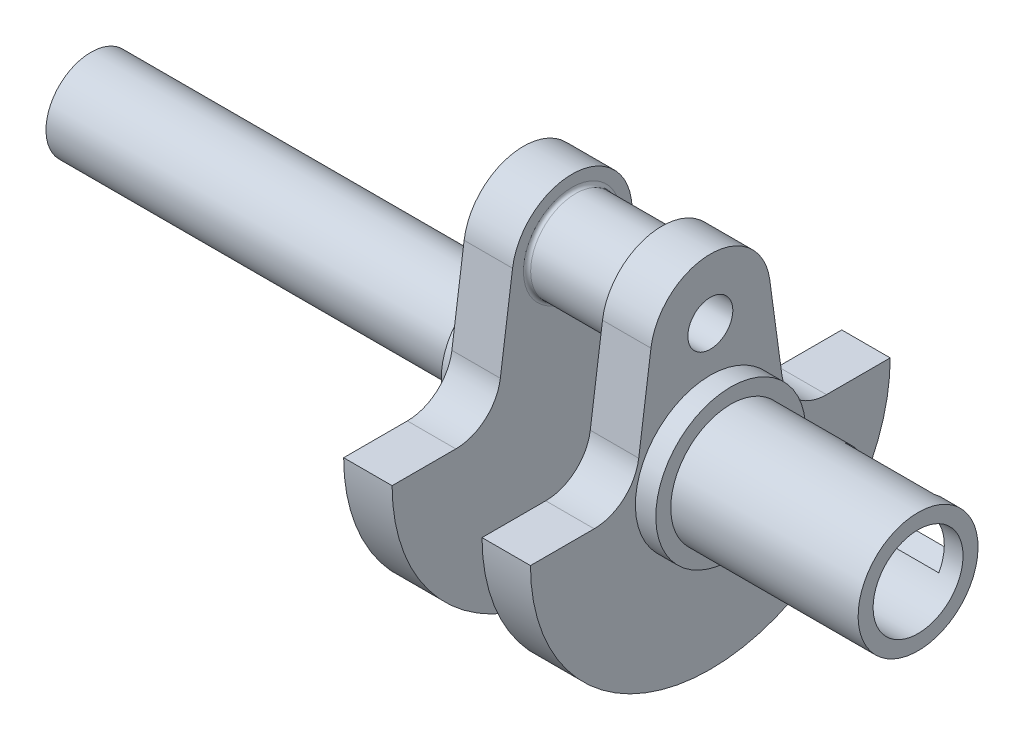
ISO-10303-21;
HEADER;
FILE_DESCRIPTION(('STEP AP214'),'2;1');
FILE_NAME('part.step','',(''),(''),'','','');
FILE_SCHEMA(('AUTOMOTIVE_DESIGN { 1 0 10303 214 1 1 1 1 }'));
ENDSEC;
DATA;
#1=APPLICATION_CONTEXT('core data for automotive mechanical design processes');
#2=APPLICATION_PROTOCOL_DEFINITION('international standard','automotive_design',2000,#1);
#3=PRODUCT_CONTEXT('',#1,'mechanical');
#4=PRODUCT('Part','Part','',(#3));
#5=PRODUCT_RELATED_PRODUCT_CATEGORY('part','',(#4));
#6=PRODUCT_DEFINITION_FORMATION('','',#4);
#7=PRODUCT_DEFINITION_CONTEXT('part definition',#1,'design');
#8=PRODUCT_DEFINITION('design','',#6,#7);
#9=PRODUCT_DEFINITION_SHAPE('','',#8);
#10=(LENGTH_UNIT() NAMED_UNIT(*) SI_UNIT(.MILLI.,.METRE.));
#11=(NAMED_UNIT(*) PLANE_ANGLE_UNIT() SI_UNIT($,.RADIAN.));
#12=(NAMED_UNIT(*) SI_UNIT($,.STERADIAN.) SOLID_ANGLE_UNIT());
#13=UNCERTAINTY_MEASURE_WITH_UNIT(LENGTH_MEASURE(1.E-05),#10,'distance_accuracy_value','');
#14=(GEOMETRIC_REPRESENTATION_CONTEXT(3) GLOBAL_UNCERTAINTY_ASSIGNED_CONTEXT((#13)) GLOBAL_UNIT_ASSIGNED_CONTEXT((#10,
#11,#12)) REPRESENTATION_CONTEXT('',''));
#15=CARTESIAN_POINT('',(0.,0.,0.));
#16=DIRECTION('',(0.,0.,1.));
#17=DIRECTION('',(1.,0.,0.));
#18=AXIS2_PLACEMENT_3D('',#15,#16,#17);
#19=CARTESIAN_POINT('',(2.159,6.5484375,0.));
#20=DIRECTION('',(-1.,0.,0.));
#21=DIRECTION('',(0.,-1.,0.));
#22=AXIS2_PLACEMENT_3D('',#19,#20,#21);
#23=PLANE('',#22);
#24=CARTESIAN_POINT('',(2.159,12.7,0.));
#25=DIRECTION('',(-1.,0.,0.));
#26=DIRECTION('',(0.,0.,1.));
#27=AXIS2_PLACEMENT_3D('',#24,#25,#26);
#28=CIRCLE('',#27,2.38124999999999);
#29=CARTESIAN_POINT('',(2.159,12.7,2.38124999999999));
#30=VERTEX_POINT('',#29);
#31=EDGE_CURVE('E548',#30,#30,#28,.T.);
#32=ORIENTED_EDGE('',*,*,#31,.F.);
#33=EDGE_LOOP('',(#32));
#34=FACE_BOUND('',#33,.T.);
#35=CARTESIAN_POINT('',(2.159,0.,0.));
#36=DIRECTION('',(1.,0.,0.));
#37=DIRECTION('',(0.,1.,0.));
#38=AXIS2_PLACEMENT_3D('',#35,#36,#37);
#39=CIRCLE('',#38,6.5484375);
#40=CARTESIAN_POINT('',(2.159,6.5484375,0.));
#41=VERTEX_POINT('',#40);
#42=EDGE_CURVE('E210',#41,#41,#39,.T.);
#43=ORIENTED_EDGE('',*,*,#42,.T.);
#44=EDGE_LOOP('',(#43));
#45=FACE_BOUND('',#44,.T.);
#46=CARTESIAN_POINT('',(2.159,12.7,0.));
#47=DIRECTION('',(-1.,0.,0.));
#48=DIRECTION('',(0.,-1.,0.));
#49=AXIS2_PLACEMENT_3D('',#46,#47,#48);
#50=CIRCLE('',#49,6.35);
#51=CARTESIAN_POINT('',(2.159,13.561498356535,6.29128926228063));
#52=VERTEX_POINT('',#51);
#53=CARTESIAN_POINT('',(2.159,13.561498356535,-6.29128926228063));
#54=VERTEX_POINT('',#53);
#55=EDGE_CURVE('E380',#52,#54,#50,.T.);
#56=ORIENTED_EDGE('',*,*,#55,.T.);
#57=DIRECTION('',(0.,-0.990754214532383,-0.135669032525193));
#58=VECTOR('',#57,1.);
#59=CARTESIAN_POINT('',(2.159,7.52316204732083,-7.11814947959444));
#60=LINE('',#59,#58);
#61=CARTESIAN_POINT('',(2.159,4.11637623259877,-7.58465805328953));
#62=VERTEX_POINT('',#61);
#63=EDGE_CURVE('E316',#54,#62,#60,.T.);
#64=ORIENTED_EDGE('',*,*,#63,.T.);
#65=CARTESIAN_POINT('',(2.159,4.7625,-12.303125));
#66=DIRECTION('',(-1.,0.,0.));
#67=DIRECTION('',(0.,-1.,0.));
#68=AXIS2_PLACEMENT_3D('',#65,#66,#67);
#69=CIRCLE('',#68,4.7625);
#70=CARTESIAN_POINT('',(2.159,0.,-12.303125));
#71=VERTEX_POINT('',#70);
#72=EDGE_CURVE('E204',#62,#71,#69,.F.);
#73=ORIENTED_EDGE('',*,*,#72,.T.);
#74=DIRECTION('',(0.,0.,1.));
#75=VECTOR('',#74,1.);
#76=CARTESIAN_POINT('',(2.159,0.,0.));
#77=LINE('',#76,#75);
#78=CARTESIAN_POINT('',(2.159,0.,-19.05));
#79=VERTEX_POINT('',#78);
#80=EDGE_CURVE('E186',#79,#71,#77,.T.);
#81=ORIENTED_EDGE('',*,*,#80,.F.);
#82=CARTESIAN_POINT('',(2.159,0.,0.));
#83=DIRECTION('',(1.,0.,0.));
#84=DIRECTION('',(0.,1.,0.));
#85=AXIS2_PLACEMENT_3D('',#82,#83,#84);
#86=CIRCLE('',#85,19.05);
#87=CARTESIAN_POINT('',(2.159,0.,19.05));
#88=VERTEX_POINT('',#87);
#89=EDGE_CURVE('E202',#88,#79,#86,.T.);
#90=ORIENTED_EDGE('',*,*,#89,.F.);
#91=DIRECTION('',(0.,0.,-1.));
#92=VECTOR('',#91,1.);
#93=CARTESIAN_POINT('',(2.159,0.,0.));
#94=LINE('',#93,#92);
#95=CARTESIAN_POINT('',(2.159,0.,12.303125));
#96=VERTEX_POINT('',#95);
#97=EDGE_CURVE('E351',#88,#96,#94,.T.);
#98=ORIENTED_EDGE('',*,*,#97,.T.);
#99=CARTESIAN_POINT('',(2.159,4.7625,12.303125));
#100=DIRECTION('',(-1.,0.,0.));
#101=DIRECTION('',(0.,-1.,0.));
#102=AXIS2_PLACEMENT_3D('',#99,#100,#101);
#103=CIRCLE('',#102,4.7625);
#104=CARTESIAN_POINT('',(2.159,4.11637623259877,7.58465805328953));
#105=VERTEX_POINT('',#104);
#106=EDGE_CURVE('E360',#105,#96,#103,.T.);
#107=ORIENTED_EDGE('',*,*,#106,.F.);
#108=DIRECTION('',(0.,-0.990754214532383,0.135669032525193));
#109=VECTOR('',#108,1.);
#110=CARTESIAN_POINT('',(2.159,7.52316204732083,7.11814947959444));
#111=LINE('',#110,#109);
#112=EDGE_CURVE('E369',#52,#105,#111,.T.);
#113=ORIENTED_EDGE('',*,*,#112,.F.);
#114=EDGE_LOOP('',(#56,#64,#73,#81,#90,#98,#107,#113));
#115=FACE_BOUND('',#114,.T.);
#116=ADVANCED_FACE('F45',(#34,#45,#115),#23,.T.);
#117=CARTESIAN_POINT('',(7.2898,19.05,0.));
#118=DIRECTION('',(1.,0.,0.));
#119=DIRECTION('',(0.,1.,0.));
#120=AXIS2_PLACEMENT_3D('',#117,#118,#119);
#121=PLANE('',#120);
#122=CARTESIAN_POINT('',(7.2898,12.7,0.));
#123=DIRECTION('',(1.,0.,0.));
#124=DIRECTION('',(0.,1.,0.));
#125=AXIS2_PLACEMENT_3D('',#122,#123,#124);
#126=CIRCLE('',#125,5.13715);
#127=CARTESIAN_POINT('',(7.2898,17.83715,0.));
#128=VERTEX_POINT('',#127);
#129=EDGE_CURVE('E245',#128,#128,#126,.F.);
#130=ORIENTED_EDGE('',*,*,#129,.T.);
#131=EDGE_LOOP('',(#130));
#132=FACE_BOUND('',#131,.T.);
#133=DIRECTION('',(0.,0.990754214532383,0.135669032525193));
#134=VECTOR('',#133,1.);
#135=CARTESIAN_POINT('',(7.2898,19.7946197079818,-5.43775613473088));
#136=LINE('',#135,#134);
#137=CARTESIAN_POINT('',(7.2898,4.11637623259877,-7.58465805328953));
#138=VERTEX_POINT('',#137);
#139=CARTESIAN_POINT('',(7.2898,13.561498356535,-6.29128926228063));
#140=VERTEX_POINT('',#139);
#141=EDGE_CURVE('E312',#138,#140,#136,.T.);
#142=ORIENTED_EDGE('',*,*,#141,.T.);
#143=CARTESIAN_POINT('',(7.2898,12.7,0.));
#144=DIRECTION('',(1.,0.,0.));
#145=DIRECTION('',(0.,1.,0.));
#146=AXIS2_PLACEMENT_3D('',#143,#144,#145);
#147=CIRCLE('',#146,6.35);
#148=CARTESIAN_POINT('',(7.2898,13.561498356535,6.29128926228063));
#149=VERTEX_POINT('',#148);
#150=EDGE_CURVE('E376',#140,#149,#147,.T.);
#151=ORIENTED_EDGE('',*,*,#150,.T.);
#152=DIRECTION('',(0.,0.990754214532383,-0.135669032525193));
#153=VECTOR('',#152,1.);
#154=CARTESIAN_POINT('',(7.2898,19.7946197079818,5.43775613473088));
#155=LINE('',#154,#153);
#156=CARTESIAN_POINT('',(7.2898,4.11637623259877,7.58465805328953));
#157=VERTEX_POINT('',#156);
#158=EDGE_CURVE('E366',#157,#149,#155,.T.);
#159=ORIENTED_EDGE('',*,*,#158,.F.);
#160=CARTESIAN_POINT('',(7.2898,4.7625,12.303125));
#161=DIRECTION('',(1.,0.,0.));
#162=DIRECTION('',(0.,1.,0.));
#163=AXIS2_PLACEMENT_3D('',#160,#161,#162);
#164=CIRCLE('',#163,4.7625);
#165=CARTESIAN_POINT('',(7.28980000000001,0.,12.303125));
#166=VERTEX_POINT('',#165);
#167=EDGE_CURVE('E357',#166,#157,#164,.T.);
#168=ORIENTED_EDGE('',*,*,#167,.F.);
#169=DIRECTION('',(0.,0.,1.));
#170=VECTOR('',#169,1.);
#171=CARTESIAN_POINT('',(7.2898,0.,0.));
#172=LINE('',#171,#170);
#173=CARTESIAN_POINT('',(7.2898,0.,19.05));
#174=VERTEX_POINT('',#173);
#175=EDGE_CURVE('E348',#166,#174,#172,.T.);
#176=ORIENTED_EDGE('',*,*,#175,.T.);
#177=CARTESIAN_POINT('',(7.2898,0.,0.));
#178=DIRECTION('',(1.,0.,0.));
#179=DIRECTION('',(0.,1.,0.));
#180=AXIS2_PLACEMENT_3D('',#177,#178,#179);
#181=CIRCLE('',#180,19.05);
#182=CARTESIAN_POINT('',(7.28980000000001,0.,-19.05));
#183=VERTEX_POINT('',#182);
#184=EDGE_CURVE('E211',#174,#183,#181,.T.);
#185=ORIENTED_EDGE('',*,*,#184,.T.);
#186=DIRECTION('',(0.,0.,-1.));
#187=VECTOR('',#186,1.);
#188=CARTESIAN_POINT('',(7.2898,0.,0.));
#189=LINE('',#188,#187);
#190=CARTESIAN_POINT('',(7.28980000000001,0.,-12.303125));
#191=VERTEX_POINT('',#190);
#192=EDGE_CURVE('E189',#191,#183,#189,.T.);
#193=ORIENTED_EDGE('',*,*,#192,.F.);
#194=CARTESIAN_POINT('',(7.2898,4.7625,-12.303125));
#195=DIRECTION('',(1.,0.,0.));
#196=DIRECTION('',(0.,1.,0.));
#197=AXIS2_PLACEMENT_3D('',#194,#195,#196);
#198=CIRCLE('',#197,4.7625);
#199=EDGE_CURVE('E322',#191,#138,#198,.F.);
#200=ORIENTED_EDGE('',*,*,#199,.T.);
#201=EDGE_LOOP('',(#142,#151,#159,#168,#176,#185,#193,#200));
#202=FACE_BOUND('',#201,.T.);
#203=ADVANCED_FACE('F483',(#132,#202),#121,.T.);
#204=CARTESIAN_POINT('',(21.9456,19.05,0.));
#205=DIRECTION('',(1.,0.,0.));
#206=DIRECTION('',(0.,1.,0.));
#207=AXIS2_PLACEMENT_3D('',#204,#205,#206);
#208=PLANE('',#207);
#209=CARTESIAN_POINT('',(21.9456,12.7,0.));
#210=DIRECTION('',(1.,0.,0.));
#211=DIRECTION('',(0.,1.,0.));
#212=AXIS2_PLACEMENT_3D('',#209,#210,#211);
#213=CIRCLE('',#212,2.38124999999999);
#214=CARTESIAN_POINT('',(21.9456,15.08125,0.));
#215=VERTEX_POINT('',#214);
#216=EDGE_CURVE('E297',#215,#215,#213,.T.);
#217=ORIENTED_EDGE('',*,*,#216,.F.);
#218=EDGE_LOOP('',(#217));
#219=FACE_BOUND('',#218,.T.);
#220=CARTESIAN_POINT('',(21.9456,0.,0.));
#221=DIRECTION('',(1.,0.,0.));
#222=DIRECTION('',(0.,1.,0.));
#223=AXIS2_PLACEMENT_3D('',#220,#221,#222);
#224=CIRCLE('',#223,7.9375);
#225=CARTESIAN_POINT('',(21.9456,7.9375,0.));
#226=VERTEX_POINT('',#225);
#227=EDGE_CURVE('E453',#226,#226,#224,.T.);
#228=ORIENTED_EDGE('',*,*,#227,.F.);
#229=EDGE_LOOP('',(#228));
#230=FACE_BOUND('',#229,.T.);
#231=DIRECTION('',(0.,0.990754214532383,0.135669032525193));
#232=VECTOR('',#231,1.);
#233=CARTESIAN_POINT('',(21.9456,19.7946197079818,-5.43775613473088));
#234=LINE('',#233,#232);
#235=CARTESIAN_POINT('',(21.9456,4.11637623259877,-7.58465805328953));
#236=VERTEX_POINT('',#235);
#237=CARTESIAN_POINT('',(21.9456,13.561498356535,-6.29128926228063));
#238=VERTEX_POINT('',#237);
#239=EDGE_CURVE('E206',#236,#238,#234,.T.);
#240=ORIENTED_EDGE('',*,*,#239,.T.);
#241=CARTESIAN_POINT('',(21.9456,12.7,0.));
#242=DIRECTION('',(1.,0.,0.));
#243=DIRECTION('',(0.,1.,0.));
#244=AXIS2_PLACEMENT_3D('',#241,#242,#243);
#245=CIRCLE('',#244,6.35);
#246=CARTESIAN_POINT('',(21.9456,13.561498356535,6.29128926228063));
#247=VERTEX_POINT('',#246);
#248=EDGE_CURVE('E372',#238,#247,#245,.T.);
#249=ORIENTED_EDGE('',*,*,#248,.T.);
#250=DIRECTION('',(0.,0.990754214532383,-0.135669032525193));
#251=VECTOR('',#250,1.);
#252=CARTESIAN_POINT('',(21.9456,19.7946197079818,5.43775613473088));
#253=LINE('',#252,#251);
#254=CARTESIAN_POINT('',(21.9456,4.11637623259877,7.58465805328953));
#255=VERTEX_POINT('',#254);
#256=EDGE_CURVE('E363',#255,#247,#253,.T.);
#257=ORIENTED_EDGE('',*,*,#256,.F.);
#258=CARTESIAN_POINT('',(21.9456,4.7625,12.303125));
#259=DIRECTION('',(1.,0.,0.));
#260=DIRECTION('',(0.,1.,0.));
#261=AXIS2_PLACEMENT_3D('',#258,#259,#260);
#262=CIRCLE('',#261,4.7625);
#263=CARTESIAN_POINT('',(21.9456,0.,12.303125));
#264=VERTEX_POINT('',#263);
#265=EDGE_CURVE('E354',#264,#255,#262,.T.);
#266=ORIENTED_EDGE('',*,*,#265,.F.);
#267=DIRECTION('',(0.,0.,1.));
#268=VECTOR('',#267,1.);
#269=CARTESIAN_POINT('',(21.9456,0.,0.));
#270=LINE('',#269,#268);
#271=CARTESIAN_POINT('',(21.9456,0.,19.05));
#272=VERTEX_POINT('',#271);
#273=EDGE_CURVE('E344',#264,#272,#270,.T.);
#274=ORIENTED_EDGE('',*,*,#273,.T.);
#275=CARTESIAN_POINT('',(21.9456,0.,0.));
#276=DIRECTION('',(1.,0.,0.));
#277=DIRECTION('',(0.,1.,0.));
#278=AXIS2_PLACEMENT_3D('',#275,#276,#277);
#279=CIRCLE('',#278,19.05);
#280=CARTESIAN_POINT('',(21.9456,0.,-19.05));
#281=VERTEX_POINT('',#280);
#282=EDGE_CURVE('E218',#272,#281,#279,.T.);
#283=ORIENTED_EDGE('',*,*,#282,.T.);
#284=DIRECTION('',(0.,0.,-1.));
#285=VECTOR('',#284,1.);
#286=CARTESIAN_POINT('',(21.9456,0.,0.));
#287=LINE('',#286,#285);
#288=CARTESIAN_POINT('',(21.9456,0.,-12.303125));
#289=VERTEX_POINT('',#288);
#290=EDGE_CURVE('E293',#289,#281,#287,.T.);
#291=ORIENTED_EDGE('',*,*,#290,.F.);
#292=CARTESIAN_POINT('',(21.9456,4.7625,-12.303125));
#293=DIRECTION('',(1.,0.,0.));
#294=DIRECTION('',(0.,1.,0.));
#295=AXIS2_PLACEMENT_3D('',#292,#293,#294);
#296=CIRCLE('',#295,4.7625);
#297=EDGE_CURVE('E319',#289,#236,#296,.F.);
#298=ORIENTED_EDGE('',*,*,#297,.T.);
#299=EDGE_LOOP('',(#240,#249,#257,#266,#274,#283,#291,#298));
#300=FACE_BOUND('',#299,.T.);
#301=ADVANCED_FACE('F461',(#219,#230,#300),#208,.T.);
#302=CARTESIAN_POINT('',(16.8148,4.7625,0.));
#303=DIRECTION('',(-1.,0.,0.));
#304=DIRECTION('',(0.,-1.,0.));
#305=AXIS2_PLACEMENT_3D('',#302,#303,#304);
#306=PLANE('',#305);
#307=CARTESIAN_POINT('',(16.8148,12.7,0.));
#308=DIRECTION('',(-1.,0.,0.));
#309=DIRECTION('',(0.,-1.,0.));
#310=AXIS2_PLACEMENT_3D('',#307,#308,#309);
#311=CIRCLE('',#310,5.13715);
#312=CARTESIAN_POINT('',(16.8148,7.56285,0.));
#313=VERTEX_POINT('',#312);
#314=EDGE_CURVE('E241',#313,#313,#311,.F.);
#315=ORIENTED_EDGE('',*,*,#314,.T.);
#316=EDGE_LOOP('',(#315));
#317=FACE_BOUND('',#316,.T.);
#318=CARTESIAN_POINT('',(16.8148,0.,0.));
#319=DIRECTION('',(1.,0.,0.));
#320=DIRECTION('',(0.,1.,0.));
#321=AXIS2_PLACEMENT_3D('',#318,#319,#320);
#322=CIRCLE('',#321,4.7625);
#323=CARTESIAN_POINT('',(16.8148,4.7625,0.));
#324=VERTEX_POINT('',#323);
#325=EDGE_CURVE('E433',#324,#324,#322,.T.);
#326=ORIENTED_EDGE('',*,*,#325,.T.);
#327=EDGE_LOOP('',(#326));
#328=FACE_BOUND('',#327,.T.);
#329=CARTESIAN_POINT('',(16.8148,12.7,0.));
#330=DIRECTION('',(-1.,0.,0.));
#331=DIRECTION('',(0.,-1.,0.));
#332=AXIS2_PLACEMENT_3D('',#329,#330,#331);
#333=CIRCLE('',#332,6.35);
#334=CARTESIAN_POINT('',(16.8148,13.561498356535,6.29128926228063));
#335=VERTEX_POINT('',#334);
#336=CARTESIAN_POINT('',(16.8148,13.561498356535,-6.29128926228063));
#337=VERTEX_POINT('',#336);
#338=EDGE_CURVE('E259',#335,#337,#333,.T.);
#339=ORIENTED_EDGE('',*,*,#338,.T.);
#340=DIRECTION('',(0.,-0.990754214532383,-0.135669032525193));
#341=VECTOR('',#340,1.);
#342=CARTESIAN_POINT('',(16.8148,5.77009666722641,-7.35820567171781));
#343=LINE('',#342,#341);
#344=CARTESIAN_POINT('',(16.8148,4.11637623259877,-7.58465805328953));
#345=VERTEX_POINT('',#344);
#346=EDGE_CURVE('E11',#337,#345,#343,.T.);
#347=ORIENTED_EDGE('',*,*,#346,.T.);
#348=CARTESIAN_POINT('',(16.8148,4.7625,-12.303125));
#349=DIRECTION('',(-1.,0.,0.));
#350=DIRECTION('',(0.,-1.,0.));
#351=AXIS2_PLACEMENT_3D('',#348,#349,#350);
#352=CIRCLE('',#351,4.7625);
#353=CARTESIAN_POINT('',(16.8148,0.,-12.303125));
#354=VERTEX_POINT('',#353);
#355=EDGE_CURVE('E54',#345,#354,#352,.F.);
#356=ORIENTED_EDGE('',*,*,#355,.T.);
#357=DIRECTION('',(0.,0.,1.));
#358=VECTOR('',#357,1.);
#359=CARTESIAN_POINT('',(16.8148,0.,0.));
#360=LINE('',#359,#358);
#361=CARTESIAN_POINT('',(16.8148,0.,-19.05));
#362=VERTEX_POINT('',#361);
#363=EDGE_CURVE('E262',#362,#354,#360,.T.);
#364=ORIENTED_EDGE('',*,*,#363,.F.);
#365=CARTESIAN_POINT('',(16.8148,0.,0.));
#366=DIRECTION('',(1.,0.,0.));
#367=DIRECTION('',(0.,1.,0.));
#368=AXIS2_PLACEMENT_3D('',#365,#366,#367);
#369=CIRCLE('',#368,19.05);
#370=CARTESIAN_POINT('',(16.8148,0.,19.05));
#371=VERTEX_POINT('',#370);
#372=EDGE_CURVE('E430',#371,#362,#369,.T.);
#373=ORIENTED_EDGE('',*,*,#372,.F.);
#374=DIRECTION('',(0.,0.,-1.));
#375=VECTOR('',#374,1.);
#376=CARTESIAN_POINT('',(16.8148,0.,0.));
#377=LINE('',#376,#375);
#378=CARTESIAN_POINT('',(16.8148,0.,12.303125));
#379=VERTEX_POINT('',#378);
#380=EDGE_CURVE('E249',#371,#379,#377,.T.);
#381=ORIENTED_EDGE('',*,*,#380,.T.);
#382=CARTESIAN_POINT('',(16.8148,4.7625,12.303125));
#383=DIRECTION('',(-1.,0.,0.));
#384=DIRECTION('',(0.,-1.,0.));
#385=AXIS2_PLACEMENT_3D('',#382,#383,#384);
#386=CIRCLE('',#385,4.7625);
#387=CARTESIAN_POINT('',(16.8148,4.11637623259877,7.58465805328953));
#388=VERTEX_POINT('',#387);
#389=EDGE_CURVE('E253',#388,#379,#386,.T.);
#390=ORIENTED_EDGE('',*,*,#389,.F.);
#391=DIRECTION('',(0.,-0.990754214532383,0.135669032525193));
#392=VECTOR('',#391,1.);
#393=CARTESIAN_POINT('',(16.8148,5.77009666722641,7.35820567171781));
#394=LINE('',#393,#392);
#395=EDGE_CURVE('E256',#335,#388,#394,.T.);
#396=ORIENTED_EDGE('',*,*,#395,.F.);
#397=EDGE_LOOP('',(#339,#347,#356,#364,#373,#381,#390,#396));
#398=FACE_BOUND('',#397,.T.);
#399=ADVANCED_FACE('F268',(#317,#328,#398),#306,.T.);
#400=CARTESIAN_POINT('',(0.,0.,0.));
#401=DIRECTION('',(1.,0.,0.));
#402=DIRECTION('',(0.,1.,0.));
#403=AXIS2_PLACEMENT_3D('',#400,#401,#402);
#404=CYLINDRICAL_SURFACE('',#403,19.05);
#405=DIRECTION('',(1.,0.,0.));
#406=VECTOR('',#405,1.);
#407=CARTESIAN_POINT('',(-43.65625,0.,-19.05));
#408=LINE('',#407,#406);
#409=EDGE_CURVE('E182',#79,#183,#408,.T.);
#410=ORIENTED_EDGE('',*,*,#409,.T.);
#411=ORIENTED_EDGE('',*,*,#184,.F.);
#412=DIRECTION('',(1.,0.,0.));
#413=VECTOR('',#412,1.);
#414=CARTESIAN_POINT('',(-43.65625,0.,19.05));
#415=LINE('',#414,#413);
#416=EDGE_CURVE('E61',#88,#174,#415,.T.);
#417=ORIENTED_EDGE('',*,*,#416,.F.);
#418=ORIENTED_EDGE('',*,*,#89,.T.);
#419=EDGE_LOOP('',(#410,#411,#417,#418));
#420=FACE_BOUND('',#419,.T.);
#421=ADVANCED_FACE('F208',(#420),#404,.T.);
#422=CARTESIAN_POINT('',(0.,0.,0.));
#423=DIRECTION('',(1.,0.,0.));
#424=DIRECTION('',(0.,1.,0.));
#425=AXIS2_PLACEMENT_3D('',#422,#423,#424);
#426=CYLINDRICAL_SURFACE('',#425,19.05);
#427=EDGE_CURVE('E196',#362,#281,#408,.T.);
#428=ORIENTED_EDGE('',*,*,#427,.T.);
#429=ORIENTED_EDGE('',*,*,#282,.F.);
#430=EDGE_CURVE('E328',#371,#272,#415,.T.);
#431=ORIENTED_EDGE('',*,*,#430,.F.);
#432=ORIENTED_EDGE('',*,*,#372,.T.);
#433=EDGE_LOOP('',(#428,#429,#431,#432));
#434=FACE_BOUND('',#433,.T.);
#435=ADVANCED_FACE('F465',(#434),#426,.T.);
#436=CARTESIAN_POINT('',(-43.65625,0.,0.));
#437=DIRECTION('',(-1.,0.,0.));
#438=DIRECTION('',(0.,-1.,0.));
#439=AXIS2_PLACEMENT_3D('',#436,#437,#438);
#440=PLANE('',#439);
#441=CARTESIAN_POINT('',(-43.65625,0.,0.));
#442=DIRECTION('',(1.,0.,0.));
#443=DIRECTION('',(0.,1.,0.));
#444=AXIS2_PLACEMENT_3D('',#441,#442,#443);
#445=CIRCLE('',#444,4.7625);
#446=CARTESIAN_POINT('',(-43.65625,4.76249999999999,0.));
#447=VERTEX_POINT('',#446);
#448=EDGE_CURVE('E229',#447,#447,#445,.T.);
#449=ORIENTED_EDGE('',*,*,#448,.F.);
#450=EDGE_LOOP('',(#449));
#451=FACE_BOUND('',#450,.T.);
#452=ADVANCED_FACE('F508',(#451),#440,.T.);
#453=CARTESIAN_POINT('',(0.,0.,0.));
#454=DIRECTION('',(1.,0.,0.));
#455=DIRECTION('',(0.,1.,0.));
#456=AXIS2_PLACEMENT_3D('',#453,#454,#455);
#457=CYLINDRICAL_SURFACE('',#456,4.7625);
#458=ORIENTED_EDGE('',*,*,#448,.T.);
#459=EDGE_LOOP('',(#458));
#460=FACE_BOUND('',#459,.T.);
#461=CARTESIAN_POINT('',(0.,0.,0.));
#462=DIRECTION('',(1.,0.,0.));
#463=DIRECTION('',(0.,1.,0.));
#464=AXIS2_PLACEMENT_3D('',#461,#462,#463);
#465=CIRCLE('',#464,4.76249999999999);
#466=CARTESIAN_POINT('',(0.,4.76249999999999,0.));
#467=VERTEX_POINT('',#466);
#468=EDGE_CURVE('E225',#467,#467,#465,.T.);
#469=ORIENTED_EDGE('',*,*,#468,.F.);
#470=EDGE_LOOP('',(#469));
#471=FACE_BOUND('',#470,.T.);
#472=ADVANCED_FACE('F504',(#460,#471),#457,.T.);
#473=CARTESIAN_POINT('',(0.,4.76249999999999,0.));
#474=DIRECTION('',(-1.,0.,0.));
#475=DIRECTION('',(0.,-1.,0.));
#476=AXIS2_PLACEMENT_3D('',#473,#474,#475);
#477=PLANE('',#476);
#478=ORIENTED_EDGE('',*,*,#468,.T.);
#479=EDGE_LOOP('',(#478));
#480=FACE_BOUND('',#479,.T.);
#481=CARTESIAN_POINT('',(0.,0.,0.));
#482=DIRECTION('',(1.,0.,0.));
#483=DIRECTION('',(0.,1.,0.));
#484=AXIS2_PLACEMENT_3D('',#481,#482,#483);
#485=CIRCLE('',#484,6.5484375);
#486=CARTESIAN_POINT('',(0.,6.5484375,0.));
#487=VERTEX_POINT('',#486);
#488=EDGE_CURVE('E216',#487,#487,#485,.T.);
#489=ORIENTED_EDGE('',*,*,#488,.F.);
#490=EDGE_LOOP('',(#489));
#491=FACE_BOUND('',#490,.T.);
#492=ADVANCED_FACE('F500',(#480,#491),#477,.T.);
#493=CARTESIAN_POINT('',(0.,0.,0.));
#494=DIRECTION('',(1.,0.,0.));
#495=DIRECTION('',(0.,1.,0.));
#496=AXIS2_PLACEMENT_3D('',#493,#494,#495);
#497=CYLINDRICAL_SURFACE('',#496,6.5484375);
#498=ORIENTED_EDGE('',*,*,#488,.T.);
#499=EDGE_LOOP('',(#498));
#500=FACE_BOUND('',#499,.T.);
#501=ORIENTED_EDGE('',*,*,#42,.F.);
#502=EDGE_LOOP('',(#501));
#503=FACE_BOUND('',#502,.T.);
#504=ADVANCED_FACE('F496',(#500,#503),#497,.T.);
#505=CARTESIAN_POINT('',(-15.5534869071741,12.7,0.));
#506=DIRECTION('',(-1.,0.,0.));
#507=DIRECTION('',(0.,0.,1.));
#508=AXIS2_PLACEMENT_3D('',#505,#506,#507);
#509=CYLINDRICAL_SURFACE('',#508,4.75615);
#510=CARTESIAN_POINT('',(16.4338,12.7,0.));
#511=DIRECTION('',(-1.,0.,0.));
#512=DIRECTION('',(0.,-1.,0.));
#513=AXIS2_PLACEMENT_3D('',#510,#511,#512);
#514=CIRCLE('',#513,4.75615);
#515=CARTESIAN_POINT('',(16.4338,7.94385,0.));
#516=VERTEX_POINT('',#515);
#517=EDGE_CURVE('E237',#516,#516,#514,.T.);
#518=ORIENTED_EDGE('',*,*,#517,.T.);
#519=EDGE_LOOP('',(#518));
#520=FACE_BOUND('',#519,.T.);
#521=CARTESIAN_POINT('',(7.6708,12.7,0.));
#522=DIRECTION('',(1.,0.,0.));
#523=DIRECTION('',(0.,1.,0.));
#524=AXIS2_PLACEMENT_3D('',#521,#522,#523);
#525=CIRCLE('',#524,4.75615);
#526=CARTESIAN_POINT('',(7.6708,17.45615,0.));
#527=VERTEX_POINT('',#526);
#528=EDGE_CURVE('E233',#527,#527,#525,.T.);
#529=ORIENTED_EDGE('',*,*,#528,.T.);
#530=EDGE_LOOP('',(#529));
#531=FACE_BOUND('',#530,.T.);
#532=ADVANCED_FACE('F499',(#520,#531),#509,.T.);
#533=CARTESIAN_POINT('',(0.,0.,0.));
#534=DIRECTION('',(1.,0.,0.));
#535=DIRECTION('',(0.,1.,0.));
#536=AXIS2_PLACEMENT_3D('',#533,#534,#535);
#537=CYLINDRICAL_SURFACE('',#536,7.9375);
#538=ORIENTED_EDGE('',*,*,#227,.T.);
#539=EDGE_LOOP('',(#538));
#540=FACE_BOUND('',#539,.T.);
#541=CARTESIAN_POINT('',(24.1046,0.,0.));
#542=DIRECTION('',(1.,0.,0.));
#543=DIRECTION('',(0.,1.,0.));
#544=AXIS2_PLACEMENT_3D('',#541,#542,#543);
#545=CIRCLE('',#544,7.9375);
#546=CARTESIAN_POINT('',(24.1046,7.9375,0.));
#547=VERTEX_POINT('',#546);
#548=EDGE_CURVE('E449',#547,#547,#545,.T.);
#549=ORIENTED_EDGE('',*,*,#548,.F.);
#550=EDGE_LOOP('',(#549));
#551=FACE_BOUND('',#550,.T.);
#552=ADVANCED_FACE('F531',(#540,#551),#537,.T.);
#553=CARTESIAN_POINT('',(24.1046,7.9375,0.));
#554=DIRECTION('',(1.,0.,0.));
#555=DIRECTION('',(0.,1.,0.));
#556=AXIS2_PLACEMENT_3D('',#553,#554,#555);
#557=PLANE('',#556);
#558=ORIENTED_EDGE('',*,*,#548,.T.);
#559=EDGE_LOOP('',(#558));
#560=FACE_BOUND('',#559,.T.);
#561=CARTESIAN_POINT('',(24.1046,0.,0.));
#562=DIRECTION('',(1.,0.,0.));
#563=DIRECTION('',(0.,1.,0.));
#564=AXIS2_PLACEMENT_3D('',#561,#562,#563);
#565=CIRCLE('',#564,6.35);
#566=CARTESIAN_POINT('',(24.1046,6.35,0.));
#567=VERTEX_POINT('',#566);
#568=EDGE_CURVE('E445',#567,#567,#565,.T.);
#569=ORIENTED_EDGE('',*,*,#568,.F.);
#570=EDGE_LOOP('',(#569));
#571=FACE_BOUND('',#570,.T.);
#572=ADVANCED_FACE('F559',(#560,#571),#557,.T.);
#573=CARTESIAN_POINT('',(0.,0.,0.));
#574=DIRECTION('',(1.,0.,0.));
#575=DIRECTION('',(0.,1.,0.));
#576=AXIS2_PLACEMENT_3D('',#573,#574,#575);
#577=CYLINDRICAL_SURFACE('',#576,6.35);
#578=DIRECTION('',(1.,0.,0.));
#579=VECTOR('',#578,1.);
#580=CARTESIAN_POINT('',(0.,5.15212599880757,-3.71188600207645));
#581=LINE('',#580,#579);
#582=CARTESIAN_POINT('',(41.963975,5.15212599880757,-3.71188600207645));
#583=VERTEX_POINT('',#582);
#584=CARTESIAN_POINT('',(32.438975,5.15212599880757,-3.71188600207645));
#585=VERTEX_POINT('',#584);
#586=EDGE_CURVE('E383',#583,#585,#581,.F.);
#587=ORIENTED_EDGE('',*,*,#586,.T.);
#588=CARTESIAN_POINT('',(32.438975,0.,0.));
#589=DIRECTION('',(-1.,0.,0.));
#590=DIRECTION('',(0.,0.,1.));
#591=AXIS2_PLACEMENT_3D('',#588,#589,#590);
#592=CIRCLE('',#591,6.35);
#593=CARTESIAN_POINT('',(32.438975,-1.56080316093177,-6.15519240095916));
#594=VERTEX_POINT('',#593);
#595=EDGE_CURVE('E396',#585,#594,#592,.T.);
#596=ORIENTED_EDGE('',*,*,#595,.T.);
#597=DIRECTION('',(1.,0.,0.));
#598=VECTOR('',#597,1.);
#599=CARTESIAN_POINT('',(0.,-1.56080316093178,-6.15519240095916));
#600=LINE('',#599,#598);
#601=CARTESIAN_POINT('',(41.963975,-1.56080316093178,-6.15519240095916));
#602=VERTEX_POINT('',#601);
#603=EDGE_CURVE('E410',#594,#602,#600,.T.);
#604=ORIENTED_EDGE('',*,*,#603,.T.);
#605=CARTESIAN_POINT('',(41.963975,0.,0.));
#606=DIRECTION('',(1.,0.,0.));
#607=DIRECTION('',(0.,0.,-1.));
#608=AXIS2_PLACEMENT_3D('',#605,#606,#607);
#609=CIRCLE('',#608,6.35);
#610=EDGE_CURVE('E414',#602,#583,#609,.T.);
#611=ORIENTED_EDGE('',*,*,#610,.T.);
#612=EDGE_LOOP('',(#587,#596,#604,#611));
#613=FACE_BOUND('',#612,.T.);
#614=ORIENTED_EDGE('',*,*,#568,.T.);
#615=EDGE_LOOP('',(#614));
#616=FACE_BOUND('',#615,.T.);
#617=CARTESIAN_POINT('',(43.94835,0.,0.));
#618=DIRECTION('',(1.,0.,0.));
#619=DIRECTION('',(0.,1.,0.));
#620=AXIS2_PLACEMENT_3D('',#617,#618,#619);
#621=CIRCLE('',#620,6.35);
#622=CARTESIAN_POINT('',(43.94835,6.35,0.));
#623=VERTEX_POINT('',#622);
#624=EDGE_CURVE('E441',#623,#623,#621,.T.);
#625=ORIENTED_EDGE('',*,*,#624,.F.);
#626=EDGE_LOOP('',(#625));
#627=FACE_BOUND('',#626,.T.);
#628=ADVANCED_FACE('F565',(#613,#616,#627),#577,.T.);
#629=CARTESIAN_POINT('',(43.94835,6.35,0.));
#630=DIRECTION('',(1.,0.,0.));
#631=DIRECTION('',(0.,1.,0.));
#632=AXIS2_PLACEMENT_3D('',#629,#630,#631);
#633=PLANE('',#632);
#634=ORIENTED_EDGE('',*,*,#624,.T.);
#635=EDGE_LOOP('',(#634));
#636=FACE_BOUND('',#635,.T.);
#637=CARTESIAN_POINT('',(43.94835,0.,0.));
#638=DIRECTION('',(1.,0.,0.));
#639=DIRECTION('',(0.,1.,0.));
#640=AXIS2_PLACEMENT_3D('',#637,#638,#639);
#641=CIRCLE('',#640,4.7625);
#642=CARTESIAN_POINT('',(43.94835,4.76250000000001,0.));
#643=VERTEX_POINT('',#642);
#644=EDGE_CURVE('E437',#643,#643,#641,.T.);
#645=ORIENTED_EDGE('',*,*,#644,.F.);
#646=EDGE_LOOP('',(#645));
#647=FACE_BOUND('',#646,.T.);
#648=ADVANCED_FACE('F571',(#636,#647),#633,.T.);
#649=CARTESIAN_POINT('',(0.,0.,0.));
#650=DIRECTION('',(1.,0.,0.));
#651=DIRECTION('',(0.,1.,0.));
#652=AXIS2_PLACEMENT_3D('',#649,#650,#651);
#653=CYLINDRICAL_SURFACE('',#652,4.7625);
#654=DIRECTION('',(1.,0.,0.));
#655=VECTOR('',#654,1.);
#656=CARTESIAN_POINT('',(0.,4.43386143123241,-1.73847032146934));
#657=LINE('',#656,#655);
#658=CARTESIAN_POINT('',(32.438975,4.43386143123241,-1.73847032146934));
#659=VERTEX_POINT('',#658);
#660=CARTESIAN_POINT('',(41.963975,4.43386143123241,-1.73847032146934));
#661=VERTEX_POINT('',#660);
#662=EDGE_CURVE('E387',#659,#661,#657,.T.);
#663=ORIENTED_EDGE('',*,*,#662,.T.);
#664=CARTESIAN_POINT('',(41.963975,0.,0.));
#665=DIRECTION('',(1.,0.,0.));
#666=DIRECTION('',(0.,0.,-1.));
#667=AXIS2_PLACEMENT_3D('',#664,#665,#666);
#668=CIRCLE('',#667,4.7625);
#669=CARTESIAN_POINT('',(41.963975,-2.27906772850694,-4.18177672035203));
#670=VERTEX_POINT('',#669);
#671=EDGE_CURVE('E426',#661,#670,#668,.F.);
#672=ORIENTED_EDGE('',*,*,#671,.T.);
#673=DIRECTION('',(1.,0.,0.));
#674=VECTOR('',#673,1.);
#675=CARTESIAN_POINT('',(0.,-2.27906772850694,-4.18177672035203));
#676=LINE('',#675,#674);
#677=CARTESIAN_POINT('',(32.438975,-2.27906772850694,-4.18177672035203));
#678=VERTEX_POINT('',#677);
#679=EDGE_CURVE('E422',#670,#678,#676,.F.);
#680=ORIENTED_EDGE('',*,*,#679,.T.);
#681=CARTESIAN_POINT('',(32.438975,0.,0.));
#682=DIRECTION('',(-1.,0.,0.));
#683=DIRECTION('',(0.,0.,1.));
#684=AXIS2_PLACEMENT_3D('',#681,#682,#683);
#685=CIRCLE('',#684,4.7625);
#686=EDGE_CURVE('E418',#678,#659,#685,.F.);
#687=ORIENTED_EDGE('',*,*,#686,.T.);
#688=EDGE_LOOP('',(#663,#672,#680,#687));
#689=FACE_BOUND('',#688,.T.);
#690=ORIENTED_EDGE('',*,*,#644,.T.);
#691=EDGE_LOOP('',(#690));
#692=FACE_BOUND('',#691,.T.);
#693=ORIENTED_EDGE('',*,*,#325,.F.);
#694=EDGE_LOOP('',(#693));
#695=FACE_BOUND('',#694,.T.);
#696=ADVANCED_FACE('F578',(#689,#692,#695),#653,.F.);
#697=CARTESIAN_POINT('',(41.963975,-4.99495245326958,24.1669829184403));
#698=DIRECTION('',(0.,0.939692620785909,0.342020143325666));
#699=DIRECTION('',(0.,-0.342020143325666,0.939692620785909));
#700=AXIS2_PLACEMENT_3D('',#697,#698,#699);
#701=PLANE('',#700);
#702=DIRECTION('',(0.,0.342020143325666,-0.939692620785909));
#703=VECTOR('',#702,1.);
#704=CARTESIAN_POINT('',(41.963975,-4.99495245326958,24.1669829184403));
#705=LINE('',#704,#703);
#706=EDGE_CURVE('E397',#661,#583,#705,.T.);
#707=ORIENTED_EDGE('',*,*,#706,.F.);
#708=ORIENTED_EDGE('',*,*,#662,.F.);
#709=DIRECTION('',(0.,0.342020143325666,-0.939692620785909));
#710=VECTOR('',#709,1.);
#711=CARTESIAN_POINT('',(32.438975,-4.99495245326958,24.1669829184403));
#712=LINE('',#711,#710);
#713=EDGE_CURVE('E392',#659,#585,#712,.T.);
#714=ORIENTED_EDGE('',*,*,#713,.T.);
#715=ORIENTED_EDGE('',*,*,#586,.F.);
#716=EDGE_LOOP('',(#707,#708,#714,#715));
#717=FACE_BOUND('',#716,.T.);
#718=ADVANCED_FACE('F584',(#717),#701,.F.);
#719=CARTESIAN_POINT('',(41.963975,-4.99495245326958,24.1669829184403));
#720=DIRECTION('',(1.,0.,0.));
#721=DIRECTION('',(0.,0.,-1.));
#722=AXIS2_PLACEMENT_3D('',#719,#720,#721);
#723=PLANE('',#722);
#724=DIRECTION('',(0.,0.342020143325666,-0.939692620785909));
#725=VECTOR('',#724,1.);
#726=CARTESIAN_POINT('',(41.963975,-11.7078816130089,21.7236765195576));
#727=LINE('',#726,#725);
#728=EDGE_CURVE('E401',#670,#602,#727,.T.);
#729=ORIENTED_EDGE('',*,*,#728,.F.);
#730=ORIENTED_EDGE('',*,*,#671,.F.);
#731=ORIENTED_EDGE('',*,*,#706,.T.);
#732=ORIENTED_EDGE('',*,*,#610,.F.);
#733=EDGE_LOOP('',(#729,#730,#731,#732));
#734=FACE_BOUND('',#733,.T.);
#735=ADVANCED_FACE('F768',(#734),#723,.F.);
#736=CARTESIAN_POINT('',(41.963975,-11.7078816130089,21.7236765195576));
#737=DIRECTION('',(0.,-0.939692620785909,-0.342020143325666));
#738=DIRECTION('',(0.,0.342020143325666,-0.939692620785909));
#739=AXIS2_PLACEMENT_3D('',#736,#737,#738);
#740=PLANE('',#739);
#741=DIRECTION('',(0.,0.342020143325666,-0.939692620785909));
#742=VECTOR('',#741,1.);
#743=CARTESIAN_POINT('',(32.438975,-11.7078816130089,21.7236765195576));
#744=LINE('',#743,#742);
#745=EDGE_CURVE('E391',#678,#594,#744,.T.);
#746=ORIENTED_EDGE('',*,*,#745,.F.);
#747=ORIENTED_EDGE('',*,*,#679,.F.);
#748=ORIENTED_EDGE('',*,*,#728,.T.);
#749=ORIENTED_EDGE('',*,*,#603,.F.);
#750=EDGE_LOOP('',(#746,#747,#748,#749));
#751=FACE_BOUND('',#750,.T.);
#752=ADVANCED_FACE('F523',(#751),#740,.F.);
#753=CARTESIAN_POINT('',(32.438975,-4.99495245326958,24.1669829184403));
#754=DIRECTION('',(-1.,0.,0.));
#755=DIRECTION('',(0.,0.,1.));
#756=AXIS2_PLACEMENT_3D('',#753,#754,#755);
#757=PLANE('',#756);
#758=ORIENTED_EDGE('',*,*,#713,.F.);
#759=ORIENTED_EDGE('',*,*,#686,.F.);
#760=ORIENTED_EDGE('',*,*,#745,.T.);
#761=ORIENTED_EDGE('',*,*,#595,.F.);
#762=EDGE_LOOP('',(#758,#759,#760,#761));
#763=FACE_BOUND('',#762,.T.);
#764=ADVANCED_FACE('F514',(#763),#757,.F.);
#765=CARTESIAN_POINT('',(16.4338,12.7,0.));
#766=DIRECTION('',(-1.,0.,0.));
#767=DIRECTION('',(0.,-1.,0.));
#768=AXIS2_PLACEMENT_3D('',#765,#766,#767);
#769=TOROIDAL_SURFACE('',#768,5.13715,0.381);
#770=ORIENTED_EDGE('',*,*,#314,.F.);
#771=EDGE_LOOP('',(#770));
#772=FACE_BOUND('',#771,.T.);
#773=ORIENTED_EDGE('',*,*,#517,.F.);
#774=EDGE_LOOP('',(#773));
#775=FACE_BOUND('',#774,.T.);
#776=ADVANCED_FACE('F512',(#772,#775),#769,.F.);
#777=CARTESIAN_POINT('',(7.6708,12.7,0.));
#778=DIRECTION('',(1.,0.,0.));
#779=DIRECTION('',(0.,1.,0.));
#780=AXIS2_PLACEMENT_3D('',#777,#778,#779);
#781=TOROIDAL_SURFACE('',#780,5.13715,0.381);
#782=ORIENTED_EDGE('',*,*,#528,.F.);
#783=EDGE_LOOP('',(#782));
#784=FACE_BOUND('',#783,.T.);
#785=ORIENTED_EDGE('',*,*,#129,.F.);
#786=EDGE_LOOP('',(#785));
#787=FACE_BOUND('',#786,.T.);
#788=ADVANCED_FACE('F47',(#784,#787),#781,.F.);
#789=CARTESIAN_POINT('',(-43.65625,0.,0.));
#790=DIRECTION('',(0.,1.,0.));
#791=DIRECTION('',(0.,0.,1.));
#792=AXIS2_PLACEMENT_3D('',#789,#790,#791);
#793=PLANE('',#792);
#794=DIRECTION('',(1.,0.,0.));
#795=VECTOR('',#794,1.);
#796=CARTESIAN_POINT('',(-43.65625,0.,12.303125));
#797=LINE('',#796,#795);
#798=EDGE_CURVE('E69',#379,#264,#797,.T.);
#799=ORIENTED_EDGE('',*,*,#798,.F.);
#800=ORIENTED_EDGE('',*,*,#380,.F.);
#801=ORIENTED_EDGE('',*,*,#430,.T.);
#802=ORIENTED_EDGE('',*,*,#273,.F.);
#803=EDGE_LOOP('',(#799,#800,#801,#802));
#804=FACE_BOUND('',#803,.T.);
#805=ADVANCED_FACE('F520',(#804),#793,.T.);
#806=CARTESIAN_POINT('',(-43.65625,4.76249999999999,12.303125));
#807=DIRECTION('',(1.,0.,0.));
#808=DIRECTION('',(0.,1.,0.));
#809=AXIS2_PLACEMENT_3D('',#806,#807,#808);
#810=CYLINDRICAL_SURFACE('',#809,4.7625);
#811=ORIENTED_EDGE('',*,*,#265,.T.);
#812=DIRECTION('',(1.,0.,0.));
#813=VECTOR('',#812,1.);
#814=CARTESIAN_POINT('',(-43.65625,4.11637623259876,7.58465805328953));
#815=LINE('',#814,#813);
#816=EDGE_CURVE('E335',#388,#255,#815,.T.);
#817=ORIENTED_EDGE('',*,*,#816,.F.);
#818=ORIENTED_EDGE('',*,*,#389,.T.);
#819=ORIENTED_EDGE('',*,*,#798,.T.);
#820=EDGE_LOOP('',(#811,#817,#818,#819));
#821=FACE_BOUND('',#820,.T.);
#822=ADVANCED_FACE('F612',(#821),#810,.F.);
#823=CARTESIAN_POINT('',(-43.65625,1.09525565364125,7.99835551738012));
#824=DIRECTION('',(0.,-0.135669032525193,-0.990754214532382));
#825=DIRECTION('',(0.,0.990754214532383,-0.135669032525193));
#826=AXIS2_PLACEMENT_3D('',#823,#824,#825);
#827=PLANE('',#826);
#828=ORIENTED_EDGE('',*,*,#256,.T.);
#829=DIRECTION('',(1.,0.,0.));
#830=VECTOR('',#829,1.);
#831=CARTESIAN_POINT('',(-43.65625,13.561498356535,6.29128926228063));
#832=LINE('',#831,#830);
#833=EDGE_CURVE('E329',#335,#247,#832,.T.);
#834=ORIENTED_EDGE('',*,*,#833,.F.);
#835=ORIENTED_EDGE('',*,*,#395,.T.);
#836=ORIENTED_EDGE('',*,*,#816,.T.);
#837=EDGE_LOOP('',(#828,#834,#835,#836));
#838=FACE_BOUND('',#837,.T.);
#839=ADVANCED_FACE('F620',(#838),#827,.F.);
#840=CARTESIAN_POINT('',(-43.65625,12.7,0.));
#841=DIRECTION('',(1.,0.,0.));
#842=DIRECTION('',(0.,1.,0.));
#843=AXIS2_PLACEMENT_3D('',#840,#841,#842);
#844=CYLINDRICAL_SURFACE('',#843,6.35);
#845=ORIENTED_EDGE('',*,*,#248,.F.);
#846=DIRECTION('',(1.,0.,0.));
#847=VECTOR('',#846,1.);
#848=CARTESIAN_POINT('',(-43.65625,13.561498356535,-6.29128926228063));
#849=LINE('',#848,#847);
#850=EDGE_CURVE('E195',#337,#238,#849,.T.);
#851=ORIENTED_EDGE('',*,*,#850,.F.);
#852=ORIENTED_EDGE('',*,*,#338,.F.);
#853=ORIENTED_EDGE('',*,*,#833,.T.);
#854=EDGE_LOOP('',(#845,#851,#852,#853));
#855=FACE_BOUND('',#854,.T.);
#856=ADVANCED_FACE('F630',(#855),#844,.T.);
#857=EDGE_CURVE('E333',#52,#149,#832,.T.);
#858=ORIENTED_EDGE('',*,*,#857,.T.);
#859=ORIENTED_EDGE('',*,*,#150,.F.);
#860=EDGE_CURVE('E288',#54,#140,#849,.T.);
#861=ORIENTED_EDGE('',*,*,#860,.F.);
#862=ORIENTED_EDGE('',*,*,#55,.F.);
#863=EDGE_LOOP('',(#858,#859,#861,#862));
#864=FACE_BOUND('',#863,.T.);
#865=ADVANCED_FACE('F641',(#864),#844,.T.);
#866=ORIENTED_EDGE('',*,*,#112,.T.);
#867=EDGE_CURVE('E334',#105,#157,#815,.T.);
#868=ORIENTED_EDGE('',*,*,#867,.T.);
#869=ORIENTED_EDGE('',*,*,#158,.T.);
#870=ORIENTED_EDGE('',*,*,#857,.F.);
#871=EDGE_LOOP('',(#866,#868,#869,#870));
#872=FACE_BOUND('',#871,.T.);
#873=ADVANCED_FACE('F633',(#872),#827,.F.);
#874=ORIENTED_EDGE('',*,*,#106,.T.);
#875=EDGE_CURVE('E339',#96,#166,#797,.T.);
#876=ORIENTED_EDGE('',*,*,#875,.T.);
#877=ORIENTED_EDGE('',*,*,#167,.T.);
#878=ORIENTED_EDGE('',*,*,#867,.F.);
#879=EDGE_LOOP('',(#874,#876,#877,#878));
#880=FACE_BOUND('',#879,.T.);
#881=ADVANCED_FACE('F623',(#880),#810,.F.);
#882=ORIENTED_EDGE('',*,*,#416,.T.);
#883=ORIENTED_EDGE('',*,*,#175,.F.);
#884=ORIENTED_EDGE('',*,*,#875,.F.);
#885=ORIENTED_EDGE('',*,*,#97,.F.);
#886=EDGE_LOOP('',(#882,#883,#884,#885));
#887=FACE_BOUND('',#886,.T.);
#888=ADVANCED_FACE('F482',(#887),#793,.T.);
#889=CARTESIAN_POINT('',(-43.65625,0.,0.));
#890=DIRECTION('',(0.,-1.,0.));
#891=DIRECTION('',(0.,0.,-1.));
#892=AXIS2_PLACEMENT_3D('',#889,#890,#891);
#893=PLANE('',#892);
#894=ORIENTED_EDGE('',*,*,#80,.T.);
#895=DIRECTION('',(1.,0.,0.));
#896=VECTOR('',#895,1.);
#897=CARTESIAN_POINT('',(-43.65625,0.,-12.303125));
#898=LINE('',#897,#896);
#899=EDGE_CURVE('E303',#71,#191,#898,.T.);
#900=ORIENTED_EDGE('',*,*,#899,.T.);
#901=ORIENTED_EDGE('',*,*,#192,.T.);
#902=ORIENTED_EDGE('',*,*,#409,.F.);
#903=EDGE_LOOP('',(#894,#900,#901,#902));
#904=FACE_BOUND('',#903,.T.);
#905=ADVANCED_FACE('F184',(#904),#893,.F.);
#906=CARTESIAN_POINT('',(-43.65625,1.09525565364125,-7.99835551738012));
#907=DIRECTION('',(0.,0.135669032525193,-0.990754214532382));
#908=DIRECTION('',(0.,0.990754214532383,0.135669032525193));
#909=AXIS2_PLACEMENT_3D('',#906,#907,#908);
#910=PLANE('',#909);
#911=ORIENTED_EDGE('',*,*,#860,.T.);
#912=ORIENTED_EDGE('',*,*,#141,.F.);
#913=DIRECTION('',(1.,0.,0.));
#914=VECTOR('',#913,1.);
#915=CARTESIAN_POINT('',(-43.65625,4.11637623259876,-7.58465805328953));
#916=LINE('',#915,#914);
#917=EDGE_CURVE('E287',#62,#138,#916,.T.);
#918=ORIENTED_EDGE('',*,*,#917,.F.);
#919=ORIENTED_EDGE('',*,*,#63,.F.);
#920=EDGE_LOOP('',(#911,#912,#918,#919));
#921=FACE_BOUND('',#920,.T.);
#922=ADVANCED_FACE('F479',(#921),#910,.T.);
#923=CARTESIAN_POINT('',(-43.65625,4.76249999999999,-12.303125));
#924=DIRECTION('',(1.,0.,0.));
#925=DIRECTION('',(0.,1.,0.));
#926=AXIS2_PLACEMENT_3D('',#923,#924,#925);
#927=CYLINDRICAL_SURFACE('',#926,4.7625);
#928=ORIENTED_EDGE('',*,*,#917,.T.);
#929=ORIENTED_EDGE('',*,*,#199,.F.);
#930=ORIENTED_EDGE('',*,*,#899,.F.);
#931=ORIENTED_EDGE('',*,*,#72,.F.);
#932=EDGE_LOOP('',(#928,#929,#930,#931));
#933=FACE_BOUND('',#932,.T.);
#934=ADVANCED_FACE('F543',(#933),#927,.F.);
#935=EDGE_CURVE('E280',#354,#289,#898,.T.);
#936=ORIENTED_EDGE('',*,*,#935,.F.);
#937=ORIENTED_EDGE('',*,*,#355,.F.);
#938=EDGE_CURVE('E277',#345,#236,#916,.T.);
#939=ORIENTED_EDGE('',*,*,#938,.T.);
#940=ORIENTED_EDGE('',*,*,#297,.F.);
#941=EDGE_LOOP('',(#936,#937,#939,#940));
#942=FACE_BOUND('',#941,.T.);
#943=ADVANCED_FACE('F276',(#942),#927,.F.);
#944=ORIENTED_EDGE('',*,*,#938,.F.);
#945=ORIENTED_EDGE('',*,*,#346,.F.);
#946=ORIENTED_EDGE('',*,*,#850,.T.);
#947=ORIENTED_EDGE('',*,*,#239,.F.);
#948=EDGE_LOOP('',(#944,#945,#946,#947));
#949=FACE_BOUND('',#948,.T.);
#950=ADVANCED_FACE('F282',(#949),#910,.T.);
#951=ORIENTED_EDGE('',*,*,#290,.T.);
#952=ORIENTED_EDGE('',*,*,#427,.F.);
#953=ORIENTED_EDGE('',*,*,#363,.T.);
#954=ORIENTED_EDGE('',*,*,#935,.T.);
#955=EDGE_LOOP('',(#951,#952,#953,#954));
#956=FACE_BOUND('',#955,.T.);
#957=ADVANCED_FACE('F467',(#956),#893,.F.);
#958=CARTESIAN_POINT('',(2.159,12.7,0.));
#959=DIRECTION('',(-1.,0.,0.));
#960=DIRECTION('',(0.,0.,1.));
#961=AXIS2_PLACEMENT_3D('',#958,#959,#960);
#962=CYLINDRICAL_SURFACE('',#961,2.38124999999999);
#963=ORIENTED_EDGE('',*,*,#216,.T.);
#964=EDGE_LOOP('',(#963));
#965=FACE_BOUND('',#964,.T.);
#966=ORIENTED_EDGE('',*,*,#31,.T.);
#967=EDGE_LOOP('',(#966));
#968=FACE_BOUND('',#967,.T.);
#969=ADVANCED_FACE('F469',(#965,#968),#962,.F.);
#970=CLOSED_SHELL('',(#116,#203,#301,#399,#421,#435,#452,#472,#492,#504,#532,#552,#572,#628,
#648,#696,#718,#735,#752,#764,#776,#788,#805,#822,#839,#856,#865,#873,#881,#888,#905,#922,#934,
#943,#950,#957,#969));
#971=MANIFOLD_SOLID_BREP('B2',#970);
#972=ADVANCED_BREP_SHAPE_REPRESENTATION('',(#18,#971),#14);
#973=SHAPE_DEFINITION_REPRESENTATION(#9,#972);
ENDSEC;
END-ISO-10303-21;
